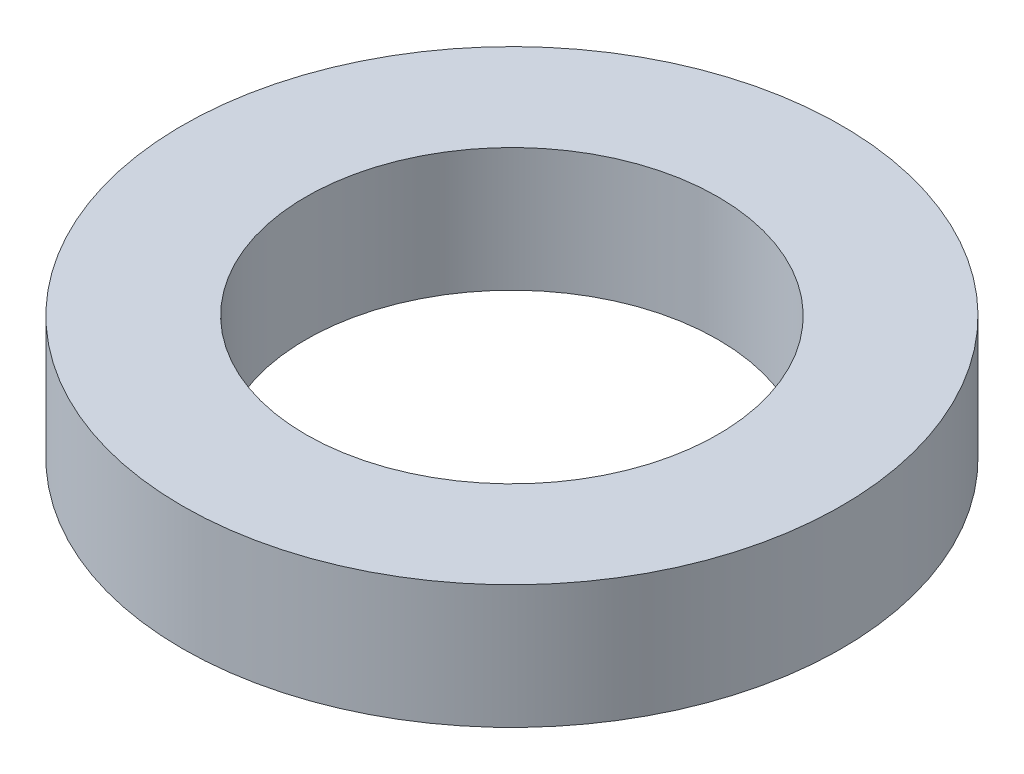
ISO-10303-21;
HEADER;
FILE_DESCRIPTION(('STEP AP214'),'2;1');
FILE_NAME('part.step','',(''),(''),'','','');
FILE_SCHEMA(('AUTOMOTIVE_DESIGN { 1 0 10303 214 1 1 1 1 }'));
ENDSEC;
DATA;
#1=APPLICATION_CONTEXT('core data for automotive mechanical design processes');
#2=APPLICATION_PROTOCOL_DEFINITION('international standard','automotive_design',2000,#1);
#3=PRODUCT_CONTEXT('',#1,'mechanical');
#4=PRODUCT('Part','Part','',(#3));
#5=PRODUCT_RELATED_PRODUCT_CATEGORY('part','',(#4));
#6=PRODUCT_DEFINITION_FORMATION('','',#4);
#7=PRODUCT_DEFINITION_CONTEXT('part definition',#1,'design');
#8=PRODUCT_DEFINITION('design','',#6,#7);
#9=PRODUCT_DEFINITION_SHAPE('','',#8);
#10=(LENGTH_UNIT() NAMED_UNIT(*) SI_UNIT(.MILLI.,.METRE.));
#11=(NAMED_UNIT(*) PLANE_ANGLE_UNIT() SI_UNIT($,.RADIAN.));
#12=(NAMED_UNIT(*) SI_UNIT($,.STERADIAN.) SOLID_ANGLE_UNIT());
#13=UNCERTAINTY_MEASURE_WITH_UNIT(LENGTH_MEASURE(1.E-05),#10,'distance_accuracy_value','');
#14=(GEOMETRIC_REPRESENTATION_CONTEXT(3) GLOBAL_UNCERTAINTY_ASSIGNED_CONTEXT((#13)) GLOBAL_UNIT_ASSIGNED_CONTEXT((#10,
#11,#12)) REPRESENTATION_CONTEXT('',''));
#15=CARTESIAN_POINT('',(0.,0.,0.));
#16=DIRECTION('',(0.,0.,1.));
#17=DIRECTION('',(1.,0.,0.));
#18=AXIS2_PLACEMENT_3D('',#15,#16,#17);
#19=CARTESIAN_POINT('',(0.,3.,0.));
#20=DIRECTION('',(0.,1.,0.));
#21=DIRECTION('',(0.,0.,0.999999999999999));
#22=AXIS2_PLACEMENT_3D('',#19,#20,#21);
#23=PLANE('',#22);
#24=CARTESIAN_POINT('',(0.,3.,0.));
#25=DIRECTION('',(0.,1.,0.));
#26=DIRECTION('',(0.,0.,0.999999999999999));
#27=AXIS2_PLACEMENT_3D('',#24,#25,#26);
#28=CIRCLE('',#27,8.);
#29=CARTESIAN_POINT('',(0.,3.,7.99999999999999));
#30=VERTEX_POINT('',#29);
#31=EDGE_CURVE('E10',#30,#30,#28,.T.);
#32=ORIENTED_EDGE('',*,*,#31,.T.);
#33=EDGE_LOOP('',(#32));
#34=FACE_BOUND('',#33,.T.);
#35=CARTESIAN_POINT('',(0.,3.,0.));
#36=DIRECTION('',(0.,1.,0.));
#37=DIRECTION('',(0.,0.,0.999999999999999));
#38=AXIS2_PLACEMENT_3D('',#35,#36,#37);
#39=CIRCLE('',#38,5.);
#40=CARTESIAN_POINT('',(0.,3.,4.99999999999999));
#41=VERTEX_POINT('',#40);
#42=EDGE_CURVE('E42',#41,#41,#39,.T.);
#43=ORIENTED_EDGE('',*,*,#42,.F.);
#44=EDGE_LOOP('',(#43));
#45=FACE_BOUND('',#44,.T.);
#46=ADVANCED_FACE('F31',(#34,#45),#23,.T.);
#47=CARTESIAN_POINT('',(0.,0.,0.));
#48=DIRECTION('',(0.,1.,0.));
#49=DIRECTION('',(0.,0.,0.999999999999999));
#50=AXIS2_PLACEMENT_3D('',#47,#48,#49);
#51=PLANE('',#50);
#52=CARTESIAN_POINT('',(0.,0.,0.));
#53=DIRECTION('',(0.,1.,0.));
#54=DIRECTION('',(0.,0.,0.999999999999999));
#55=AXIS2_PLACEMENT_3D('',#52,#53,#54);
#56=CIRCLE('',#55,8.);
#57=CARTESIAN_POINT('',(0.,0.,7.99999999999999));
#58=VERTEX_POINT('',#57);
#59=EDGE_CURVE('E35',#58,#58,#56,.T.);
#60=ORIENTED_EDGE('',*,*,#59,.F.);
#61=EDGE_LOOP('',(#60));
#62=FACE_BOUND('',#61,.T.);
#63=CARTESIAN_POINT('',(0.,0.,0.));
#64=DIRECTION('',(0.,1.,0.));
#65=DIRECTION('',(0.,0.,0.999999999999999));
#66=AXIS2_PLACEMENT_3D('',#63,#64,#65);
#67=CIRCLE('',#66,5.);
#68=CARTESIAN_POINT('',(0.,0.,4.99999999999999));
#69=VERTEX_POINT('',#68);
#70=EDGE_CURVE('E44',#69,#69,#67,.T.);
#71=ORIENTED_EDGE('',*,*,#70,.T.);
#72=EDGE_LOOP('',(#71));
#73=FACE_BOUND('',#72,.T.);
#74=ADVANCED_FACE('F54',(#62,#73),#51,.F.);
#75=CARTESIAN_POINT('',(0.,3.,0.));
#76=DIRECTION('',(0.,-1.,0.));
#77=DIRECTION('',(0.,0.,-0.999999999999999));
#78=AXIS2_PLACEMENT_3D('',#75,#76,#77);
#79=CYLINDRICAL_SURFACE('',#78,8.);
#80=ORIENTED_EDGE('',*,*,#31,.F.);
#81=EDGE_LOOP('',(#80));
#82=FACE_BOUND('',#81,.T.);
#83=ORIENTED_EDGE('',*,*,#59,.T.);
#84=EDGE_LOOP('',(#83));
#85=FACE_BOUND('',#84,.T.);
#86=ADVANCED_FACE('F33',(#82,#85),#79,.T.);
#87=CARTESIAN_POINT('',(0.,3.,0.));
#88=DIRECTION('',(0.,-1.,0.));
#89=DIRECTION('',(0.,0.,-0.999999999999999));
#90=AXIS2_PLACEMENT_3D('',#87,#88,#89);
#91=CYLINDRICAL_SURFACE('',#90,5.);
#92=ORIENTED_EDGE('',*,*,#42,.T.);
#93=EDGE_LOOP('',(#92));
#94=FACE_BOUND('',#93,.T.);
#95=ORIENTED_EDGE('',*,*,#70,.F.);
#96=EDGE_LOOP('',(#95));
#97=FACE_BOUND('',#96,.T.);
#98=ADVANCED_FACE('F50',(#94,#97),#91,.F.);
#99=CLOSED_SHELL('',(#46,#74,#86,#98));
#100=MANIFOLD_SOLID_BREP('B2',#99);
#101=ADVANCED_BREP_SHAPE_REPRESENTATION('',(#18,#100),#14);
#102=SHAPE_DEFINITION_REPRESENTATION(#9,#101);
ENDSEC;
END-ISO-10303-21;
